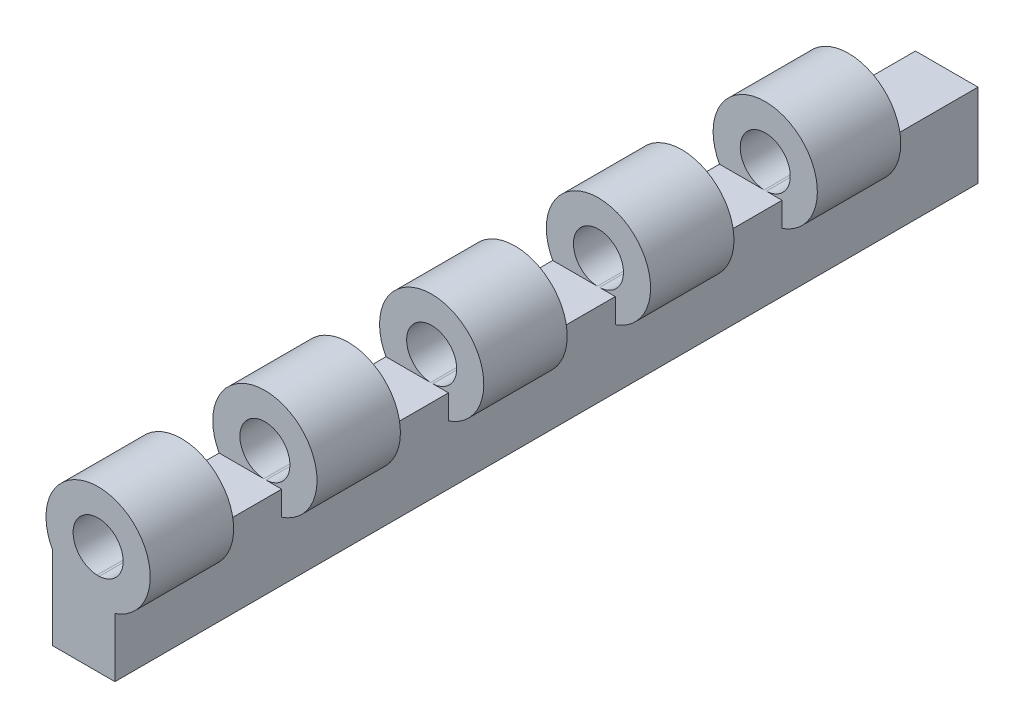
ISO-10303-21;
HEADER;
FILE_DESCRIPTION(('STEP AP214'),'2;1');
FILE_NAME('part.step','',(''),(''),'','','');
FILE_SCHEMA(('AUTOMOTIVE_DESIGN { 1 0 10303 214 1 1 1 1 }'));
ENDSEC;
DATA;
#1=APPLICATION_CONTEXT('core data for automotive mechanical design processes');
#2=APPLICATION_PROTOCOL_DEFINITION('international standard','automotive_design',2000,#1);
#3=PRODUCT_CONTEXT('',#1,'mechanical');
#4=PRODUCT('Part','Part','',(#3));
#5=PRODUCT_RELATED_PRODUCT_CATEGORY('part','',(#4));
#6=PRODUCT_DEFINITION_FORMATION('','',#4);
#7=PRODUCT_DEFINITION_CONTEXT('part definition',#1,'design');
#8=PRODUCT_DEFINITION('design','',#6,#7);
#9=PRODUCT_DEFINITION_SHAPE('','',#8);
#10=(LENGTH_UNIT() NAMED_UNIT(*) SI_UNIT(.MILLI.,.METRE.));
#11=(NAMED_UNIT(*) PLANE_ANGLE_UNIT() SI_UNIT($,.RADIAN.));
#12=(NAMED_UNIT(*) SI_UNIT($,.STERADIAN.) SOLID_ANGLE_UNIT());
#13=UNCERTAINTY_MEASURE_WITH_UNIT(LENGTH_MEASURE(1.E-05),#10,'distance_accuracy_value','');
#14=(GEOMETRIC_REPRESENTATION_CONTEXT(3) GLOBAL_UNCERTAINTY_ASSIGNED_CONTEXT((#13)) GLOBAL_UNIT_ASSIGNED_CONTEXT((#10,
#11,#12)) REPRESENTATION_CONTEXT('',''));
#15=CARTESIAN_POINT('',(0.,0.,0.));
#16=DIRECTION('',(0.,0.,1.));
#17=DIRECTION('',(1.,0.,0.));
#18=AXIS2_PLACEMENT_3D('',#15,#16,#17);
#19=CARTESIAN_POINT('',(0.,20.,0.));
#20=DIRECTION('',(0.,1.,0.));
#21=DIRECTION('',(0.,0.,1.));
#22=AXIS2_PLACEMENT_3D('',#19,#20,#21);
#23=PLANE('',#22);
#24=DIRECTION('',(0.,0.,1.));
#25=VECTOR('',#24,1.);
#26=CARTESIAN_POINT('',(0.,20.,-103.5));
#27=LINE('',#26,#25);
#28=CARTESIAN_POINT('',(0.,20.,-103.5));
#29=VERTEX_POINT('',#28);
#30=CARTESIAN_POINT('',(0.,20.,-76.5));
#31=VERTEX_POINT('',#30);
#32=EDGE_CURVE('E359',#29,#31,#27,.T.);
#33=ORIENTED_EDGE('',*,*,#32,.T.);
#34=DIRECTION('',(1.,0.,0.));
#35=VECTOR('',#34,1.);
#36=CARTESIAN_POINT('',(0.,20.,-76.5));
#37=LINE('',#36,#35);
#38=CARTESIAN_POINT('',(10.7061718741469,20.,-76.5));
#39=VERTEX_POINT('',#38);
#40=EDGE_CURVE('E50',#31,#39,#37,.T.);
#41=ORIENTED_EDGE('',*,*,#40,.T.);
#42=DIRECTION('',(0.,0.,1.));
#43=VECTOR('',#42,1.);
#44=CARTESIAN_POINT('',(10.7061718741469,20.,-76.5));
#45=LINE('',#44,#43);
#46=CARTESIAN_POINT('',(10.7061718741469,20.,-56.5));
#47=VERTEX_POINT('',#46);
#48=EDGE_CURVE('E11',#39,#47,#45,.T.);
#49=ORIENTED_EDGE('',*,*,#48,.T.);
#50=DIRECTION('',(1.,0.,0.));
#51=VECTOR('',#50,1.);
#52=CARTESIAN_POINT('',(0.,20.,-56.5));
#53=LINE('',#52,#51);
#54=CARTESIAN_POINT('',(0.,20.,-56.5));
#55=VERTEX_POINT('',#54);
#56=EDGE_CURVE('E226',#55,#47,#53,.T.);
#57=ORIENTED_EDGE('',*,*,#56,.F.);
#58=CARTESIAN_POINT('',(0.,20.,-36.5));
#59=VERTEX_POINT('',#58);
#60=EDGE_CURVE('E363',#55,#59,#27,.T.);
#61=ORIENTED_EDGE('',*,*,#60,.T.);
#62=DIRECTION('',(1.,0.,0.));
#63=VECTOR('',#62,1.);
#64=CARTESIAN_POINT('',(0.,20.,-36.5));
#65=LINE('',#64,#63);
#66=CARTESIAN_POINT('',(10.7061718741469,20.,-36.5));
#67=VERTEX_POINT('',#66);
#68=EDGE_CURVE('E267',#59,#67,#65,.T.);
#69=ORIENTED_EDGE('',*,*,#68,.T.);
#70=DIRECTION('',(0.,0.,1.));
#71=VECTOR('',#70,1.);
#72=CARTESIAN_POINT('',(10.7061718741469,20.,-36.5));
#73=LINE('',#72,#71);
#74=CARTESIAN_POINT('',(10.7061718741469,20.,-16.5));
#75=VERTEX_POINT('',#74);
#76=EDGE_CURVE('E220',#67,#75,#73,.T.);
#77=ORIENTED_EDGE('',*,*,#76,.T.);
#78=DIRECTION('',(1.,0.,0.));
#79=VECTOR('',#78,1.);
#80=CARTESIAN_POINT('',(0.,20.,-16.5));
#81=LINE('',#80,#79);
#82=CARTESIAN_POINT('',(0.,20.,-16.5));
#83=VERTEX_POINT('',#82);
#84=EDGE_CURVE('E262',#83,#75,#81,.T.);
#85=ORIENTED_EDGE('',*,*,#84,.F.);
#86=CARTESIAN_POINT('',(0.,20.,3.49999999999999));
#87=VERTEX_POINT('',#86);
#88=EDGE_CURVE('E484',#83,#87,#27,.T.);
#89=ORIENTED_EDGE('',*,*,#88,.T.);
#90=DIRECTION('',(1.,0.,0.));
#91=VECTOR('',#90,1.);
#92=CARTESIAN_POINT('',(0.,20.,3.49999999999999));
#93=LINE('',#92,#91);
#94=CARTESIAN_POINT('',(10.7061718741469,20.,3.49999999999999));
#95=VERTEX_POINT('',#94);
#96=EDGE_CURVE('E294',#87,#95,#93,.T.);
#97=ORIENTED_EDGE('',*,*,#96,.T.);
#98=DIRECTION('',(0.,0.,1.));
#99=VECTOR('',#98,1.);
#100=CARTESIAN_POINT('',(10.7061718741469,20.,3.49999999999999));
#101=LINE('',#100,#99);
#102=CARTESIAN_POINT('',(10.7061718741469,20.,23.5));
#103=VERTEX_POINT('',#102);
#104=EDGE_CURVE('E394',#95,#103,#101,.T.);
#105=ORIENTED_EDGE('',*,*,#104,.T.);
#106=DIRECTION('',(1.,0.,0.));
#107=VECTOR('',#106,1.);
#108=CARTESIAN_POINT('',(0.,20.,23.5));
#109=LINE('',#108,#107);
#110=CARTESIAN_POINT('',(0.,20.,23.5));
#111=VERTEX_POINT('',#110);
#112=EDGE_CURVE('E288',#111,#103,#109,.T.);
#113=ORIENTED_EDGE('',*,*,#112,.F.);
#114=CARTESIAN_POINT('',(0.,20.,43.5));
#115=VERTEX_POINT('',#114);
#116=EDGE_CURVE('E478',#111,#115,#27,.T.);
#117=ORIENTED_EDGE('',*,*,#116,.T.);
#118=DIRECTION('',(1.,0.,0.));
#119=VECTOR('',#118,1.);
#120=CARTESIAN_POINT('',(0.,20.,43.5));
#121=LINE('',#120,#119);
#122=CARTESIAN_POINT('',(10.7061718741469,20.,43.5));
#123=VERTEX_POINT('',#122);
#124=EDGE_CURVE('E321',#115,#123,#121,.T.);
#125=ORIENTED_EDGE('',*,*,#124,.T.);
#126=DIRECTION('',(0.,0.,1.));
#127=VECTOR('',#126,1.);
#128=CARTESIAN_POINT('',(10.7061718741469,20.,43.5));
#129=LINE('',#128,#127);
#130=CARTESIAN_POINT('',(10.7061718741469,20.,63.5));
#131=VERTEX_POINT('',#130);
#132=EDGE_CURVE('E389',#123,#131,#129,.T.);
#133=ORIENTED_EDGE('',*,*,#132,.T.);
#134=DIRECTION('',(1.,0.,0.));
#135=VECTOR('',#134,1.);
#136=CARTESIAN_POINT('',(0.,20.,63.5));
#137=LINE('',#136,#135);
#138=CARTESIAN_POINT('',(0.,20.,63.5));
#139=VERTEX_POINT('',#138);
#140=EDGE_CURVE('E315',#139,#131,#137,.T.);
#141=ORIENTED_EDGE('',*,*,#140,.F.);
#142=CARTESIAN_POINT('',(0.,20.,83.5));
#143=VERTEX_POINT('',#142);
#144=EDGE_CURVE('E472',#139,#143,#27,.T.);
#145=ORIENTED_EDGE('',*,*,#144,.T.);
#146=DIRECTION('',(1.,0.,0.));
#147=VECTOR('',#146,1.);
#148=CARTESIAN_POINT('',(0.,20.,83.5));
#149=LINE('',#148,#147);
#150=CARTESIAN_POINT('',(10.7061718741469,20.,83.5));
#151=VERTEX_POINT('',#150);
#152=EDGE_CURVE('E349',#143,#151,#149,.T.);
#153=ORIENTED_EDGE('',*,*,#152,.T.);
#154=DIRECTION('',(0.,0.,1.));
#155=VECTOR('',#154,1.);
#156=CARTESIAN_POINT('',(10.7061718741469,20.,83.5));
#157=LINE('',#156,#155);
#158=CARTESIAN_POINT('',(10.7061718741469,20.,103.5));
#159=VERTEX_POINT('',#158);
#160=EDGE_CURVE('E346',#151,#159,#157,.T.);
#161=ORIENTED_EDGE('',*,*,#160,.T.);
#162=DIRECTION('',(1.,0.,0.));
#163=VECTOR('',#162,1.);
#164=CARTESIAN_POINT('',(0.,20.,103.5));
#165=LINE('',#164,#163);
#166=CARTESIAN_POINT('',(11.2318391123888,20.,103.5));
#167=VERTEX_POINT('',#166);
#168=EDGE_CURVE('E383',#159,#167,#165,.T.);
#169=ORIENTED_EDGE('',*,*,#168,.T.);
#170=DIRECTION('',(0.,0.,1.));
#171=VECTOR('',#170,1.);
#172=CARTESIAN_POINT('',(11.2318391123888,20.,83.5));
#173=LINE('',#172,#171);
#174=CARTESIAN_POINT('',(11.2318391123888,20.,83.5));
#175=VERTEX_POINT('',#174);
#176=EDGE_CURVE('E341',#167,#175,#173,.F.);
#177=ORIENTED_EDGE('',*,*,#176,.T.);
#178=CARTESIAN_POINT('',(15.,20.,83.5));
#179=VERTEX_POINT('',#178);
#180=EDGE_CURVE('E344',#175,#179,#149,.T.);
#181=ORIENTED_EDGE('',*,*,#180,.T.);
#182=DIRECTION('',(0.,0.,-1.));
#183=VECTOR('',#182,1.);
#184=CARTESIAN_POINT('',(15.,20.,-103.5));
#185=LINE('',#184,#183);
#186=CARTESIAN_POINT('',(15.,20.,63.5));
#187=VERTEX_POINT('',#186);
#188=EDGE_CURVE('E351',#179,#187,#185,.T.);
#189=ORIENTED_EDGE('',*,*,#188,.T.);
#190=CARTESIAN_POINT('',(11.2318391123888,20.,63.5));
#191=VERTEX_POINT('',#190);
#192=EDGE_CURVE('E313',#191,#187,#137,.T.);
#193=ORIENTED_EDGE('',*,*,#192,.F.);
#194=DIRECTION('',(0.,0.,1.));
#195=VECTOR('',#194,1.);
#196=CARTESIAN_POINT('',(11.2318391123888,20.,43.5));
#197=LINE('',#196,#195);
#198=CARTESIAN_POINT('',(11.2318391123888,20.,43.5));
#199=VERTEX_POINT('',#198);
#200=EDGE_CURVE('E386',#191,#199,#197,.F.);
#201=ORIENTED_EDGE('',*,*,#200,.T.);
#202=CARTESIAN_POINT('',(15.,20.,43.5));
#203=VERTEX_POINT('',#202);
#204=EDGE_CURVE('E318',#199,#203,#121,.T.);
#205=ORIENTED_EDGE('',*,*,#204,.T.);
#206=CARTESIAN_POINT('',(15.,20.,23.5));
#207=VERTEX_POINT('',#206);
#208=EDGE_CURVE('E355',#203,#207,#185,.T.);
#209=ORIENTED_EDGE('',*,*,#208,.T.);
#210=CARTESIAN_POINT('',(11.2318391123888,20.,23.5));
#211=VERTEX_POINT('',#210);
#212=EDGE_CURVE('E286',#211,#207,#109,.T.);
#213=ORIENTED_EDGE('',*,*,#212,.F.);
#214=DIRECTION('',(0.,0.,1.));
#215=VECTOR('',#214,1.);
#216=CARTESIAN_POINT('',(11.2318391123888,20.,3.49999999999999));
#217=LINE('',#216,#215);
#218=CARTESIAN_POINT('',(11.2318391123888,20.,3.49999999999999));
#219=VERTEX_POINT('',#218);
#220=EDGE_CURVE('E391',#211,#219,#217,.F.);
#221=ORIENTED_EDGE('',*,*,#220,.T.);
#222=CARTESIAN_POINT('',(15.,20.,3.49999999999999));
#223=VERTEX_POINT('',#222);
#224=EDGE_CURVE('E291',#219,#223,#93,.T.);
#225=ORIENTED_EDGE('',*,*,#224,.T.);
#226=CARTESIAN_POINT('',(15.,20.,-16.5));
#227=VERTEX_POINT('',#226);
#228=EDGE_CURVE('E414',#223,#227,#185,.T.);
#229=ORIENTED_EDGE('',*,*,#228,.T.);
#230=CARTESIAN_POINT('',(11.2318391123888,20.,-16.5));
#231=VERTEX_POINT('',#230);
#232=EDGE_CURVE('E260',#231,#227,#81,.T.);
#233=ORIENTED_EDGE('',*,*,#232,.F.);
#234=DIRECTION('',(0.,0.,1.));
#235=VECTOR('',#234,1.);
#236=CARTESIAN_POINT('',(11.2318391123888,20.,-36.5));
#237=LINE('',#236,#235);
#238=CARTESIAN_POINT('',(11.2318391123888,20.,-36.5));
#239=VERTEX_POINT('',#238);
#240=EDGE_CURVE('E396',#231,#239,#237,.F.);
#241=ORIENTED_EDGE('',*,*,#240,.T.);
#242=CARTESIAN_POINT('',(15.,20.,-36.5));
#243=VERTEX_POINT('',#242);
#244=EDGE_CURVE('E265',#239,#243,#65,.T.);
#245=ORIENTED_EDGE('',*,*,#244,.T.);
#246=CARTESIAN_POINT('',(15.,20.,-56.5));
#247=VERTEX_POINT('',#246);
#248=EDGE_CURVE('E231',#243,#247,#185,.T.);
#249=ORIENTED_EDGE('',*,*,#248,.T.);
#250=CARTESIAN_POINT('',(11.2318391123888,20.,-56.5));
#251=VERTEX_POINT('',#250);
#252=EDGE_CURVE('E224',#251,#247,#53,.T.);
#253=ORIENTED_EDGE('',*,*,#252,.F.);
#254=DIRECTION('',(0.,0.,1.));
#255=VECTOR('',#254,1.);
#256=CARTESIAN_POINT('',(11.2318391123888,20.,-76.5));
#257=LINE('',#256,#255);
#258=CARTESIAN_POINT('',(11.2318391123888,20.,-76.5));
#259=VERTEX_POINT('',#258);
#260=EDGE_CURVE('E40',#251,#259,#257,.F.);
#261=ORIENTED_EDGE('',*,*,#260,.T.);
#262=CARTESIAN_POINT('',(15.,20.,-76.5));
#263=VERTEX_POINT('',#262);
#264=EDGE_CURVE('E240',#259,#263,#37,.T.);
#265=ORIENTED_EDGE('',*,*,#264,.T.);
#266=CARTESIAN_POINT('',(15.,20.,-103.5));
#267=VERTEX_POINT('',#266);
#268=EDGE_CURVE('E356',#263,#267,#185,.T.);
#269=ORIENTED_EDGE('',*,*,#268,.T.);
#270=DIRECTION('',(-1.,0.,0.));
#271=VECTOR('',#270,1.);
#272=CARTESIAN_POINT('',(0.,20.,-103.5));
#273=LINE('',#272,#271);
#274=EDGE_CURVE('E354',#267,#29,#273,.T.);
#275=ORIENTED_EDGE('',*,*,#274,.T.);
#276=EDGE_LOOP('',(#33,#41,#49,#57,#61,#69,#77,#85,#89,#97,#105,#113,#117,#125,#133,#141,#145,
#153,#161,#169,#177,#181,#189,#193,#201,#205,#209,#213,#221,#225,#229,#233,#241,#245,#249,#253,
#261,#265,#269,#275));
#277=FACE_BOUND('',#276,.T.);
#278=ADVANCED_FACE('F32',(#277),#23,.T.);
#279=CARTESIAN_POINT('',(15.,20.,-103.5));
#280=DIRECTION('',(-1.,0.,0.));
#281=DIRECTION('',(0.,0.,1.));
#282=AXIS2_PLACEMENT_3D('',#279,#280,#281);
#283=PLANE('',#282);
#284=DIRECTION('',(0.,1.,0.));
#285=VECTOR('',#284,1.);
#286=CARTESIAN_POINT('',(15.,20.,-76.5));
#287=LINE('',#286,#285);
#288=CARTESIAN_POINT('',(15.,14.1620350996849,-76.5));
#289=VERTEX_POINT('',#288);
#290=EDGE_CURVE('E234',#289,#263,#287,.T.);
#291=ORIENTED_EDGE('',*,*,#290,.F.);
#292=DIRECTION('',(0.,0.,1.));
#293=VECTOR('',#292,1.);
#294=CARTESIAN_POINT('',(15.,14.1620350996849,-76.5));
#295=LINE('',#294,#293);
#296=CARTESIAN_POINT('',(15.,14.1620350996849,-56.5));
#297=VERTEX_POINT('',#296);
#298=EDGE_CURVE('E242',#289,#297,#295,.T.);
#299=ORIENTED_EDGE('',*,*,#298,.T.);
#300=DIRECTION('',(0.,1.,0.));
#301=VECTOR('',#300,1.);
#302=CARTESIAN_POINT('',(15.,20.,-56.5));
#303=LINE('',#302,#301);
#304=EDGE_CURVE('E232',#297,#247,#303,.T.);
#305=ORIENTED_EDGE('',*,*,#304,.T.);
#306=ORIENTED_EDGE('',*,*,#248,.F.);
#307=DIRECTION('',(0.,1.,0.));
#308=VECTOR('',#307,1.);
#309=CARTESIAN_POINT('',(15.,20.,-36.5));
#310=LINE('',#309,#308);
#311=CARTESIAN_POINT('',(15.,14.1620350996849,-36.5));
#312=VERTEX_POINT('',#311);
#313=EDGE_CURVE('E263',#312,#243,#310,.T.);
#314=ORIENTED_EDGE('',*,*,#313,.F.);
#315=DIRECTION('',(0.,0.,1.));
#316=VECTOR('',#315,1.);
#317=CARTESIAN_POINT('',(15.,14.1620350996849,-36.5));
#318=LINE('',#317,#316);
#319=CARTESIAN_POINT('',(15.,14.1620350996849,-16.5));
#320=VERTEX_POINT('',#319);
#321=EDGE_CURVE('E268',#312,#320,#318,.T.);
#322=ORIENTED_EDGE('',*,*,#321,.T.);
#323=DIRECTION('',(0.,1.,0.));
#324=VECTOR('',#323,1.);
#325=CARTESIAN_POINT('',(15.,20.,-16.5));
#326=LINE('',#325,#324);
#327=EDGE_CURVE('E255',#320,#227,#326,.T.);
#328=ORIENTED_EDGE('',*,*,#327,.T.);
#329=ORIENTED_EDGE('',*,*,#228,.F.);
#330=DIRECTION('',(0.,1.,0.));
#331=VECTOR('',#330,1.);
#332=CARTESIAN_POINT('',(15.,20.,3.49999999999999));
#333=LINE('',#332,#331);
#334=CARTESIAN_POINT('',(15.,14.1620350996849,3.49999999999999));
#335=VERTEX_POINT('',#334);
#336=EDGE_CURVE('E289',#335,#223,#333,.T.);
#337=ORIENTED_EDGE('',*,*,#336,.F.);
#338=DIRECTION('',(0.,0.,1.));
#339=VECTOR('',#338,1.);
#340=CARTESIAN_POINT('',(15.,14.1620350996849,3.49999999999999));
#341=LINE('',#340,#339);
#342=CARTESIAN_POINT('',(15.,14.1620350996849,23.5));
#343=VERTEX_POINT('',#342);
#344=EDGE_CURVE('E295',#335,#343,#341,.T.);
#345=ORIENTED_EDGE('',*,*,#344,.T.);
#346=DIRECTION('',(0.,1.,0.));
#347=VECTOR('',#346,1.);
#348=CARTESIAN_POINT('',(15.,20.,23.5));
#349=LINE('',#348,#347);
#350=EDGE_CURVE('E281',#343,#207,#349,.T.);
#351=ORIENTED_EDGE('',*,*,#350,.T.);
#352=ORIENTED_EDGE('',*,*,#208,.F.);
#353=DIRECTION('',(0.,1.,0.));
#354=VECTOR('',#353,1.);
#355=CARTESIAN_POINT('',(15.,20.,43.5));
#356=LINE('',#355,#354);
#357=CARTESIAN_POINT('',(15.,14.1620350996849,43.5));
#358=VERTEX_POINT('',#357);
#359=EDGE_CURVE('E316',#358,#203,#356,.T.);
#360=ORIENTED_EDGE('',*,*,#359,.F.);
#361=DIRECTION('',(0.,0.,1.));
#362=VECTOR('',#361,1.);
#363=CARTESIAN_POINT('',(15.,14.1620350996849,43.5));
#364=LINE('',#363,#362);
#365=CARTESIAN_POINT('',(15.,14.1620350996849,63.5));
#366=VERTEX_POINT('',#365);
#367=EDGE_CURVE('E322',#358,#366,#364,.T.);
#368=ORIENTED_EDGE('',*,*,#367,.T.);
#369=DIRECTION('',(0.,1.,0.));
#370=VECTOR('',#369,1.);
#371=CARTESIAN_POINT('',(15.,20.,63.5));
#372=LINE('',#371,#370);
#373=EDGE_CURVE('E308',#366,#187,#372,.T.);
#374=ORIENTED_EDGE('',*,*,#373,.T.);
#375=ORIENTED_EDGE('',*,*,#188,.F.);
#376=DIRECTION('',(0.,1.,0.));
#377=VECTOR('',#376,1.);
#378=CARTESIAN_POINT('',(15.,20.,83.5));
#379=LINE('',#378,#377);
#380=CARTESIAN_POINT('',(15.,14.1620350996849,83.5));
#381=VERTEX_POINT('',#380);
#382=EDGE_CURVE('E333',#381,#179,#379,.T.);
#383=ORIENTED_EDGE('',*,*,#382,.F.);
#384=DIRECTION('',(0.,0.,1.));
#385=VECTOR('',#384,1.);
#386=CARTESIAN_POINT('',(15.,14.1620350996849,83.5));
#387=LINE('',#386,#385);
#388=CARTESIAN_POINT('',(15.,14.1620350996849,103.5));
#389=VERTEX_POINT('',#388);
#390=EDGE_CURVE('E337',#381,#389,#387,.T.);
#391=ORIENTED_EDGE('',*,*,#390,.T.);
#392=DIRECTION('',(0.,-1.,0.));
#393=VECTOR('',#392,1.);
#394=CARTESIAN_POINT('',(15.,20.,103.5));
#395=LINE('',#394,#393);
#396=CARTESIAN_POINT('',(15.,0.,103.5));
#397=VERTEX_POINT('',#396);
#398=EDGE_CURVE('E345',#389,#397,#395,.T.);
#399=ORIENTED_EDGE('',*,*,#398,.T.);
#400=DIRECTION('',(0.,0.,-1.));
#401=VECTOR('',#400,1.);
#402=CARTESIAN_POINT('',(15.,0.,-103.5));
#403=LINE('',#402,#401);
#404=CARTESIAN_POINT('',(15.,0.,-103.5));
#405=VERTEX_POINT('',#404);
#406=EDGE_CURVE('E366',#397,#405,#403,.T.);
#407=ORIENTED_EDGE('',*,*,#406,.T.);
#408=DIRECTION('',(0.,-1.,0.));
#409=VECTOR('',#408,1.);
#410=CARTESIAN_POINT('',(15.,20.,-103.5));
#411=LINE('',#410,#409);
#412=EDGE_CURVE('E377',#267,#405,#411,.T.);
#413=ORIENTED_EDGE('',*,*,#412,.F.);
#414=ORIENTED_EDGE('',*,*,#268,.F.);
#415=EDGE_LOOP('',(#291,#299,#305,#306,#314,#322,#328,#329,#337,#345,#351,#352,#360,#368,#374,
#375,#383,#391,#399,#407,#413,#414));
#416=FACE_BOUND('',#415,.T.);
#417=ADVANCED_FACE('F417',(#416),#283,.F.);
#418=CARTESIAN_POINT('',(15.,20.,103.5));
#419=DIRECTION('',(0.,0.,-1.));
#420=DIRECTION('',(-1.,0.,0.));
#421=AXIS2_PLACEMENT_3D('',#418,#419,#420);
#422=PLANE('',#421);
#423=ORIENTED_EDGE('',*,*,#398,.F.);
#424=CARTESIAN_POINT('',(10.9690054932678,25.9942404430136,103.5));
#425=DIRECTION('',(0.,0.,1.));
#426=DIRECTION('',(1.,0.,0.));
#427=AXIS2_PLACEMENT_3D('',#424,#425,#426);
#428=CIRCLE('',#427,12.5);
#429=CARTESIAN_POINT('',(0.,20.,103.5));
#430=VERTEX_POINT('',#429);
#431=EDGE_CURVE('E329',#389,#430,#428,.T.);
#432=ORIENTED_EDGE('',*,*,#431,.T.);
#433=DIRECTION('',(0.,-1.,0.));
#434=VECTOR('',#433,1.);
#435=CARTESIAN_POINT('',(0.,20.,103.5));
#436=LINE('',#435,#434);
#437=CARTESIAN_POINT('',(0.,0.,103.5));
#438=VERTEX_POINT('',#437);
#439=EDGE_CURVE('E361',#430,#438,#436,.T.);
#440=ORIENTED_EDGE('',*,*,#439,.T.);
#441=DIRECTION('',(1.,0.,0.));
#442=VECTOR('',#441,1.);
#443=CARTESIAN_POINT('',(15.,0.,103.5));
#444=LINE('',#443,#442);
#445=EDGE_CURVE('E340',#438,#397,#444,.T.);
#446=ORIENTED_EDGE('',*,*,#445,.T.);
#447=EDGE_LOOP('',(#423,#432,#440,#446));
#448=FACE_BOUND('',#447,.T.);
#449=ORIENTED_EDGE('',*,*,#168,.F.);
#450=CARTESIAN_POINT('',(10.9690054932678,25.9942404430136,103.5));
#451=DIRECTION('',(0.,0.,1.));
#452=DIRECTION('',(1.,0.,0.));
#453=AXIS2_PLACEMENT_3D('',#450,#451,#452);
#454=CIRCLE('',#453,6.);
#455=EDGE_CURVE('E325',#167,#159,#454,.T.);
#456=ORIENTED_EDGE('',*,*,#455,.F.);
#457=EDGE_LOOP('',(#449,#456));
#458=FACE_BOUND('',#457,.T.);
#459=ADVANCED_FACE('F34',(#448,#458),#422,.F.);
#460=CARTESIAN_POINT('',(0.,20.,-103.5));
#461=DIRECTION('',(0.,0.,1.));
#462=DIRECTION('',(1.,0.,0.));
#463=AXIS2_PLACEMENT_3D('',#460,#461,#462);
#464=PLANE('',#463);
#465=DIRECTION('',(-1.,0.,0.));
#466=VECTOR('',#465,1.);
#467=CARTESIAN_POINT('',(0.,0.,-103.5));
#468=LINE('',#467,#466);
#469=CARTESIAN_POINT('',(0.,0.,-103.5));
#470=VERTEX_POINT('',#469);
#471=EDGE_CURVE('E368',#405,#470,#468,.T.);
#472=ORIENTED_EDGE('',*,*,#471,.T.);
#473=DIRECTION('',(0.,-1.,0.));
#474=VECTOR('',#473,1.);
#475=CARTESIAN_POINT('',(0.,20.,-103.5));
#476=LINE('',#475,#474);
#477=EDGE_CURVE('E374',#29,#470,#476,.T.);
#478=ORIENTED_EDGE('',*,*,#477,.F.);
#479=ORIENTED_EDGE('',*,*,#274,.F.);
#480=ORIENTED_EDGE('',*,*,#412,.T.);
#481=EDGE_LOOP('',(#472,#478,#479,#480));
#482=FACE_BOUND('',#481,.T.);
#483=ADVANCED_FACE('F451',(#482),#464,.F.);
#484=CARTESIAN_POINT('',(0.,20.,-103.5));
#485=DIRECTION('',(1.,0.,0.));
#486=DIRECTION('',(0.,0.,-1.));
#487=AXIS2_PLACEMENT_3D('',#484,#485,#486);
#488=PLANE('',#487);
#489=DIRECTION('',(0.,0.,1.));
#490=VECTOR('',#489,1.);
#491=CARTESIAN_POINT('',(0.,0.,-103.5));
#492=LINE('',#491,#490);
#493=EDGE_CURVE('E370',#470,#438,#492,.T.);
#494=ORIENTED_EDGE('',*,*,#493,.T.);
#495=ORIENTED_EDGE('',*,*,#439,.F.);
#496=EDGE_CURVE('E358',#143,#430,#27,.T.);
#497=ORIENTED_EDGE('',*,*,#496,.F.);
#498=ORIENTED_EDGE('',*,*,#144,.F.);
#499=EDGE_CURVE('E475',#115,#139,#27,.T.);
#500=ORIENTED_EDGE('',*,*,#499,.F.);
#501=ORIENTED_EDGE('',*,*,#116,.F.);
#502=EDGE_CURVE('E476',#87,#111,#27,.T.);
#503=ORIENTED_EDGE('',*,*,#502,.F.);
#504=ORIENTED_EDGE('',*,*,#88,.F.);
#505=EDGE_CURVE('E481',#59,#83,#27,.T.);
#506=ORIENTED_EDGE('',*,*,#505,.F.);
#507=ORIENTED_EDGE('',*,*,#60,.F.);
#508=EDGE_CURVE('E362',#31,#55,#27,.T.);
#509=ORIENTED_EDGE('',*,*,#508,.F.);
#510=ORIENTED_EDGE('',*,*,#32,.F.);
#511=ORIENTED_EDGE('',*,*,#477,.T.);
#512=EDGE_LOOP('',(#494,#495,#497,#498,#500,#501,#503,#504,#506,#507,#509,#510,#511));
#513=FACE_BOUND('',#512,.T.);
#514=ADVANCED_FACE('F447',(#513),#488,.F.);
#515=CARTESIAN_POINT('',(0.,0.,0.));
#516=DIRECTION('',(0.,1.,0.));
#517=DIRECTION('',(0.,0.,1.));
#518=AXIS2_PLACEMENT_3D('',#515,#516,#517);
#519=PLANE('',#518);
#520=ORIENTED_EDGE('',*,*,#445,.F.);
#521=ORIENTED_EDGE('',*,*,#493,.F.);
#522=ORIENTED_EDGE('',*,*,#471,.F.);
#523=ORIENTED_EDGE('',*,*,#406,.F.);
#524=EDGE_LOOP('',(#520,#521,#522,#523));
#525=FACE_BOUND('',#524,.T.);
#526=ADVANCED_FACE('F444',(#525),#519,.F.);
#527=CARTESIAN_POINT('',(10.9690054932678,25.9942404430136,83.5));
#528=DIRECTION('',(0.,0.,1.));
#529=DIRECTION('',(1.,0.,0.));
#530=AXIS2_PLACEMENT_3D('',#527,#528,#529);
#531=CYLINDRICAL_SURFACE('',#530,12.5);
#532=ORIENTED_EDGE('',*,*,#390,.F.);
#533=CARTESIAN_POINT('',(10.9690054932678,25.9942404430136,83.5));
#534=DIRECTION('',(0.,0.,1.));
#535=DIRECTION('',(1.,0.,0.));
#536=AXIS2_PLACEMENT_3D('',#533,#534,#535);
#537=CIRCLE('',#536,12.5);
#538=EDGE_CURVE('E330',#381,#143,#537,.T.);
#539=ORIENTED_EDGE('',*,*,#538,.T.);
#540=ORIENTED_EDGE('',*,*,#496,.T.);
#541=ORIENTED_EDGE('',*,*,#431,.F.);
#542=EDGE_LOOP('',(#532,#539,#540,#541));
#543=FACE_BOUND('',#542,.T.);
#544=ADVANCED_FACE('F442',(#543),#531,.T.);
#545=CARTESIAN_POINT('',(10.9690054932678,25.9942404430136,83.5));
#546=DIRECTION('',(0.,0.,1.));
#547=DIRECTION('',(1.,0.,0.));
#548=AXIS2_PLACEMENT_3D('',#545,#546,#547);
#549=PLANE('',#548);
#550=ORIENTED_EDGE('',*,*,#152,.F.);
#551=ORIENTED_EDGE('',*,*,#538,.F.);
#552=ORIENTED_EDGE('',*,*,#382,.T.);
#553=ORIENTED_EDGE('',*,*,#180,.F.);
#554=CARTESIAN_POINT('',(10.9690054932678,25.9942404430136,83.5));
#555=DIRECTION('',(0.,0.,1.));
#556=DIRECTION('',(1.,0.,0.));
#557=AXIS2_PLACEMENT_3D('',#554,#555,#556);
#558=CIRCLE('',#557,6.);
#559=EDGE_CURVE('E326',#175,#151,#558,.T.);
#560=ORIENTED_EDGE('',*,*,#559,.T.);
#561=EDGE_LOOP('',(#550,#551,#552,#553,#560));
#562=FACE_BOUND('',#561,.T.);
#563=ADVANCED_FACE('F545',(#562),#549,.F.);
#564=CARTESIAN_POINT('',(10.9690054932678,25.9942404430136,83.5));
#565=DIRECTION('',(0.,0.,1.));
#566=DIRECTION('',(1.,0.,0.));
#567=AXIS2_PLACEMENT_3D('',#564,#565,#566);
#568=CYLINDRICAL_SURFACE('',#567,6.);
#569=ORIENTED_EDGE('',*,*,#160,.F.);
#570=ORIENTED_EDGE('',*,*,#559,.F.);
#571=ORIENTED_EDGE('',*,*,#176,.F.);
#572=ORIENTED_EDGE('',*,*,#455,.T.);
#573=EDGE_LOOP('',(#569,#570,#571,#572));
#574=FACE_BOUND('',#573,.T.);
#575=ADVANCED_FACE('F543',(#574),#568,.F.);
#576=CARTESIAN_POINT('',(10.9690054932678,25.9942404430136,43.5));
#577=DIRECTION('',(0.,0.,1.));
#578=DIRECTION('',(1.,0.,0.));
#579=AXIS2_PLACEMENT_3D('',#576,#577,#578);
#580=CYLINDRICAL_SURFACE('',#579,12.5);
#581=ORIENTED_EDGE('',*,*,#367,.F.);
#582=CARTESIAN_POINT('',(10.9690054932678,25.9942404430136,43.5));
#583=DIRECTION('',(0.,0.,1.));
#584=DIRECTION('',(1.,0.,0.));
#585=AXIS2_PLACEMENT_3D('',#582,#583,#584);
#586=CIRCLE('',#585,12.5);
#587=EDGE_CURVE('E305',#358,#115,#586,.T.);
#588=ORIENTED_EDGE('',*,*,#587,.T.);
#589=ORIENTED_EDGE('',*,*,#499,.T.);
#590=CARTESIAN_POINT('',(10.9690054932678,25.9942404430136,63.5));
#591=DIRECTION('',(0.,0.,1.));
#592=DIRECTION('',(1.,0.,0.));
#593=AXIS2_PLACEMENT_3D('',#590,#591,#592);
#594=CIRCLE('',#593,12.5);
#595=EDGE_CURVE('E302',#366,#139,#594,.T.);
#596=ORIENTED_EDGE('',*,*,#595,.F.);
#597=EDGE_LOOP('',(#581,#588,#589,#596));
#598=FACE_BOUND('',#597,.T.);
#599=ADVANCED_FACE('F536',(#598),#580,.T.);
#600=CARTESIAN_POINT('',(10.9690054932678,25.9942404430136,43.5));
#601=DIRECTION('',(0.,0.,1.));
#602=DIRECTION('',(1.,0.,0.));
#603=AXIS2_PLACEMENT_3D('',#600,#601,#602);
#604=PLANE('',#603);
#605=ORIENTED_EDGE('',*,*,#124,.F.);
#606=ORIENTED_EDGE('',*,*,#587,.F.);
#607=ORIENTED_EDGE('',*,*,#359,.T.);
#608=ORIENTED_EDGE('',*,*,#204,.F.);
#609=CARTESIAN_POINT('',(10.9690054932678,25.9942404430136,43.5));
#610=DIRECTION('',(0.,0.,1.));
#611=DIRECTION('',(1.,0.,0.));
#612=AXIS2_PLACEMENT_3D('',#609,#610,#611);
#613=CIRCLE('',#612,6.);
#614=EDGE_CURVE('E299',#199,#123,#613,.T.);
#615=ORIENTED_EDGE('',*,*,#614,.T.);
#616=EDGE_LOOP('',(#605,#606,#607,#608,#615));
#617=FACE_BOUND('',#616,.T.);
#618=ADVANCED_FACE('F533',(#617),#604,.F.);
#619=CARTESIAN_POINT('',(10.9690054932678,25.9942404430136,63.5));
#620=DIRECTION('',(0.,0.,1.));
#621=DIRECTION('',(1.,0.,0.));
#622=AXIS2_PLACEMENT_3D('',#619,#620,#621);
#623=PLANE('',#622);
#624=ORIENTED_EDGE('',*,*,#595,.T.);
#625=ORIENTED_EDGE('',*,*,#140,.T.);
#626=CARTESIAN_POINT('',(10.9690054932678,25.9942404430136,63.5));
#627=DIRECTION('',(0.,0.,1.));
#628=DIRECTION('',(1.,0.,0.));
#629=AXIS2_PLACEMENT_3D('',#626,#627,#628);
#630=CIRCLE('',#629,6.);
#631=EDGE_CURVE('E298',#191,#131,#630,.T.);
#632=ORIENTED_EDGE('',*,*,#631,.F.);
#633=ORIENTED_EDGE('',*,*,#192,.T.);
#634=ORIENTED_EDGE('',*,*,#373,.F.);
#635=EDGE_LOOP('',(#624,#625,#632,#633,#634));
#636=FACE_BOUND('',#635,.T.);
#637=ADVANCED_FACE('F531',(#636),#623,.T.);
#638=CARTESIAN_POINT('',(10.9690054932678,25.9942404430136,43.5));
#639=DIRECTION('',(0.,0.,1.));
#640=DIRECTION('',(1.,0.,0.));
#641=AXIS2_PLACEMENT_3D('',#638,#639,#640);
#642=CYLINDRICAL_SURFACE('',#641,6.);
#643=ORIENTED_EDGE('',*,*,#132,.F.);
#644=ORIENTED_EDGE('',*,*,#614,.F.);
#645=ORIENTED_EDGE('',*,*,#200,.F.);
#646=ORIENTED_EDGE('',*,*,#631,.T.);
#647=EDGE_LOOP('',(#643,#644,#645,#646));
#648=FACE_BOUND('',#647,.T.);
#649=ADVANCED_FACE('F528',(#648),#642,.F.);
#650=CARTESIAN_POINT('',(10.9690054932678,25.9942404430136,3.49999999999999));
#651=DIRECTION('',(0.,0.,1.));
#652=DIRECTION('',(1.,0.,0.));
#653=AXIS2_PLACEMENT_3D('',#650,#651,#652);
#654=CYLINDRICAL_SURFACE('',#653,12.5);
#655=ORIENTED_EDGE('',*,*,#344,.F.);
#656=CARTESIAN_POINT('',(10.9690054932678,25.9942404430136,3.49999999999999));
#657=DIRECTION('',(0.,0.,1.));
#658=DIRECTION('',(1.,0.,0.));
#659=AXIS2_PLACEMENT_3D('',#656,#657,#658);
#660=CIRCLE('',#659,12.5);
#661=EDGE_CURVE('E278',#335,#87,#660,.T.);
#662=ORIENTED_EDGE('',*,*,#661,.T.);
#663=ORIENTED_EDGE('',*,*,#502,.T.);
#664=CARTESIAN_POINT('',(10.9690054932678,25.9942404430136,23.5));
#665=DIRECTION('',(0.,0.,1.));
#666=DIRECTION('',(1.,0.,0.));
#667=AXIS2_PLACEMENT_3D('',#664,#665,#666);
#668=CIRCLE('',#667,12.5);
#669=EDGE_CURVE('E275',#343,#111,#668,.T.);
#670=ORIENTED_EDGE('',*,*,#669,.F.);
#671=EDGE_LOOP('',(#655,#662,#663,#670));
#672=FACE_BOUND('',#671,.T.);
#673=ADVANCED_FACE('F509',(#672),#654,.T.);
#674=CARTESIAN_POINT('',(10.9690054932678,25.9942404430136,3.49999999999999));
#675=DIRECTION('',(0.,0.,1.));
#676=DIRECTION('',(1.,0.,0.));
#677=AXIS2_PLACEMENT_3D('',#674,#675,#676);
#678=PLANE('',#677);
#679=ORIENTED_EDGE('',*,*,#96,.F.);
#680=ORIENTED_EDGE('',*,*,#661,.F.);
#681=ORIENTED_EDGE('',*,*,#336,.T.);
#682=ORIENTED_EDGE('',*,*,#224,.F.);
#683=CARTESIAN_POINT('',(10.9690054932678,25.9942404430136,3.49999999999999));
#684=DIRECTION('',(0.,0.,1.));
#685=DIRECTION('',(1.,0.,0.));
#686=AXIS2_PLACEMENT_3D('',#683,#684,#685);
#687=CIRCLE('',#686,6.);
#688=EDGE_CURVE('E272',#219,#95,#687,.T.);
#689=ORIENTED_EDGE('',*,*,#688,.T.);
#690=EDGE_LOOP('',(#679,#680,#681,#682,#689));
#691=FACE_BOUND('',#690,.T.);
#692=ADVANCED_FACE('F513',(#691),#678,.F.);
#693=CARTESIAN_POINT('',(10.9690054932678,25.9942404430136,23.5));
#694=DIRECTION('',(0.,0.,1.));
#695=DIRECTION('',(1.,0.,0.));
#696=AXIS2_PLACEMENT_3D('',#693,#694,#695);
#697=PLANE('',#696);
#698=ORIENTED_EDGE('',*,*,#669,.T.);
#699=ORIENTED_EDGE('',*,*,#112,.T.);
#700=CARTESIAN_POINT('',(10.9690054932678,25.9942404430136,23.5));
#701=DIRECTION('',(0.,0.,1.));
#702=DIRECTION('',(1.,0.,0.));
#703=AXIS2_PLACEMENT_3D('',#700,#701,#702);
#704=CIRCLE('',#703,6.);
#705=EDGE_CURVE('E271',#211,#103,#704,.T.);
#706=ORIENTED_EDGE('',*,*,#705,.F.);
#707=ORIENTED_EDGE('',*,*,#212,.T.);
#708=ORIENTED_EDGE('',*,*,#350,.F.);
#709=EDGE_LOOP('',(#698,#699,#706,#707,#708));
#710=FACE_BOUND('',#709,.T.);
#711=ADVANCED_FACE('F505',(#710),#697,.T.);
#712=CARTESIAN_POINT('',(10.9690054932678,25.9942404430136,3.49999999999999));
#713=DIRECTION('',(0.,0.,1.));
#714=DIRECTION('',(1.,0.,0.));
#715=AXIS2_PLACEMENT_3D('',#712,#713,#714);
#716=CYLINDRICAL_SURFACE('',#715,6.);
#717=ORIENTED_EDGE('',*,*,#104,.F.);
#718=ORIENTED_EDGE('',*,*,#688,.F.);
#719=ORIENTED_EDGE('',*,*,#220,.F.);
#720=ORIENTED_EDGE('',*,*,#705,.T.);
#721=EDGE_LOOP('',(#717,#718,#719,#720));
#722=FACE_BOUND('',#721,.T.);
#723=ADVANCED_FACE('F432',(#722),#716,.F.);
#724=CARTESIAN_POINT('',(10.9690054932678,25.9942404430136,-36.5));
#725=DIRECTION('',(0.,0.,1.));
#726=DIRECTION('',(1.,0.,0.));
#727=AXIS2_PLACEMENT_3D('',#724,#725,#726);
#728=CYLINDRICAL_SURFACE('',#727,12.5);
#729=ORIENTED_EDGE('',*,*,#321,.F.);
#730=CARTESIAN_POINT('',(10.9690054932678,25.9942404430136,-36.5));
#731=DIRECTION('',(0.,0.,1.));
#732=DIRECTION('',(1.,0.,0.));
#733=AXIS2_PLACEMENT_3D('',#730,#731,#732);
#734=CIRCLE('',#733,12.5);
#735=EDGE_CURVE('E252',#312,#59,#734,.T.);
#736=ORIENTED_EDGE('',*,*,#735,.T.);
#737=ORIENTED_EDGE('',*,*,#505,.T.);
#738=CARTESIAN_POINT('',(10.9690054932678,25.9942404430136,-16.5));
#739=DIRECTION('',(0.,0.,1.));
#740=DIRECTION('',(1.,0.,0.));
#741=AXIS2_PLACEMENT_3D('',#738,#739,#740);
#742=CIRCLE('',#741,12.5);
#743=EDGE_CURVE('E249',#320,#83,#742,.T.);
#744=ORIENTED_EDGE('',*,*,#743,.F.);
#745=EDGE_LOOP('',(#729,#736,#737,#744));
#746=FACE_BOUND('',#745,.T.);
#747=ADVANCED_FACE('F422',(#746),#728,.T.);
#748=CARTESIAN_POINT('',(10.9690054932678,25.9942404430136,-36.5));
#749=DIRECTION('',(0.,0.,1.));
#750=DIRECTION('',(1.,0.,0.));
#751=AXIS2_PLACEMENT_3D('',#748,#749,#750);
#752=PLANE('',#751);
#753=ORIENTED_EDGE('',*,*,#68,.F.);
#754=ORIENTED_EDGE('',*,*,#735,.F.);
#755=ORIENTED_EDGE('',*,*,#313,.T.);
#756=ORIENTED_EDGE('',*,*,#244,.F.);
#757=CARTESIAN_POINT('',(10.9690054932678,25.9942404430136,-36.5));
#758=DIRECTION('',(0.,0.,1.));
#759=DIRECTION('',(1.,0.,0.));
#760=AXIS2_PLACEMENT_3D('',#757,#758,#759);
#761=CIRCLE('',#760,6.);
#762=EDGE_CURVE('E246',#239,#67,#761,.T.);
#763=ORIENTED_EDGE('',*,*,#762,.T.);
#764=EDGE_LOOP('',(#753,#754,#755,#756,#763));
#765=FACE_BOUND('',#764,.T.);
#766=ADVANCED_FACE('F424',(#765),#752,.F.);
#767=CARTESIAN_POINT('',(10.9690054932678,25.9942404430136,-16.5));
#768=DIRECTION('',(0.,0.,1.));
#769=DIRECTION('',(1.,0.,0.));
#770=AXIS2_PLACEMENT_3D('',#767,#768,#769);
#771=PLANE('',#770);
#772=ORIENTED_EDGE('',*,*,#743,.T.);
#773=ORIENTED_EDGE('',*,*,#84,.T.);
#774=CARTESIAN_POINT('',(10.9690054932678,25.9942404430136,-16.5));
#775=DIRECTION('',(0.,0.,1.));
#776=DIRECTION('',(1.,0.,0.));
#777=AXIS2_PLACEMENT_3D('',#774,#775,#776);
#778=CIRCLE('',#777,6.);
#779=EDGE_CURVE('E245',#231,#75,#778,.T.);
#780=ORIENTED_EDGE('',*,*,#779,.F.);
#781=ORIENTED_EDGE('',*,*,#232,.T.);
#782=ORIENTED_EDGE('',*,*,#327,.F.);
#783=EDGE_LOOP('',(#772,#773,#780,#781,#782));
#784=FACE_BOUND('',#783,.T.);
#785=ADVANCED_FACE('F408',(#784),#771,.T.);
#786=CARTESIAN_POINT('',(10.9690054932678,25.9942404430136,-36.5));
#787=DIRECTION('',(0.,0.,1.));
#788=DIRECTION('',(1.,0.,0.));
#789=AXIS2_PLACEMENT_3D('',#786,#787,#788);
#790=CYLINDRICAL_SURFACE('',#789,6.);
#791=ORIENTED_EDGE('',*,*,#76,.F.);
#792=ORIENTED_EDGE('',*,*,#762,.F.);
#793=ORIENTED_EDGE('',*,*,#240,.F.);
#794=ORIENTED_EDGE('',*,*,#779,.T.);
#795=EDGE_LOOP('',(#791,#792,#793,#794));
#796=FACE_BOUND('',#795,.T.);
#797=ADVANCED_FACE('F411',(#796),#790,.F.);
#798=CARTESIAN_POINT('',(10.9690054932678,25.9942404430136,-76.5));
#799=DIRECTION('',(0.,0.,1.));
#800=DIRECTION('',(1.,0.,0.));
#801=AXIS2_PLACEMENT_3D('',#798,#799,#800);
#802=CYLINDRICAL_SURFACE('',#801,12.5);
#803=ORIENTED_EDGE('',*,*,#298,.F.);
#804=CARTESIAN_POINT('',(10.9690054932678,25.9942404430136,-76.5));
#805=DIRECTION('',(0.,0.,1.));
#806=DIRECTION('',(1.,0.,0.));
#807=AXIS2_PLACEMENT_3D('',#804,#805,#806);
#808=CIRCLE('',#807,12.5);
#809=EDGE_CURVE('E235',#289,#31,#808,.T.);
#810=ORIENTED_EDGE('',*,*,#809,.T.);
#811=ORIENTED_EDGE('',*,*,#508,.T.);
#812=CARTESIAN_POINT('',(10.9690054932678,25.9942404430136,-56.5));
#813=DIRECTION('',(0.,0.,1.));
#814=DIRECTION('',(1.,0.,0.));
#815=AXIS2_PLACEMENT_3D('',#812,#813,#814);
#816=CIRCLE('',#815,12.5);
#817=EDGE_CURVE('E492',#297,#55,#816,.T.);
#818=ORIENTED_EDGE('',*,*,#817,.F.);
#819=EDGE_LOOP('',(#803,#810,#811,#818));
#820=FACE_BOUND('',#819,.T.);
#821=ADVANCED_FACE('F491',(#820),#802,.T.);
#822=CARTESIAN_POINT('',(10.9690054932678,25.9942404430136,-76.5));
#823=DIRECTION('',(0.,0.,1.));
#824=DIRECTION('',(1.,0.,0.));
#825=AXIS2_PLACEMENT_3D('',#822,#823,#824);
#826=PLANE('',#825);
#827=ORIENTED_EDGE('',*,*,#40,.F.);
#828=ORIENTED_EDGE('',*,*,#809,.F.);
#829=ORIENTED_EDGE('',*,*,#290,.T.);
#830=ORIENTED_EDGE('',*,*,#264,.F.);
#831=CARTESIAN_POINT('',(10.9690054932678,25.9942404430136,-76.5));
#832=DIRECTION('',(0.,0.,1.));
#833=DIRECTION('',(1.,0.,0.));
#834=AXIS2_PLACEMENT_3D('',#831,#832,#833);
#835=CIRCLE('',#834,6.);
#836=EDGE_CURVE('E217',#259,#39,#835,.T.);
#837=ORIENTED_EDGE('',*,*,#836,.T.);
#838=EDGE_LOOP('',(#827,#828,#829,#830,#837));
#839=FACE_BOUND('',#838,.T.);
#840=ADVANCED_FACE('F497',(#839),#826,.F.);
#841=CARTESIAN_POINT('',(10.9690054932678,25.9942404430136,-56.5));
#842=DIRECTION('',(0.,0.,1.));
#843=DIRECTION('',(1.,0.,0.));
#844=AXIS2_PLACEMENT_3D('',#841,#842,#843);
#845=PLANE('',#844);
#846=ORIENTED_EDGE('',*,*,#817,.T.);
#847=ORIENTED_EDGE('',*,*,#56,.T.);
#848=CARTESIAN_POINT('',(10.9690054932678,25.9942404430136,-56.5));
#849=DIRECTION('',(0.,0.,1.));
#850=DIRECTION('',(1.,0.,0.));
#851=AXIS2_PLACEMENT_3D('',#848,#849,#850);
#852=CIRCLE('',#851,6.);
#853=EDGE_CURVE('E215',#251,#47,#852,.T.);
#854=ORIENTED_EDGE('',*,*,#853,.F.);
#855=ORIENTED_EDGE('',*,*,#252,.T.);
#856=ORIENTED_EDGE('',*,*,#304,.F.);
#857=EDGE_LOOP('',(#846,#847,#854,#855,#856));
#858=FACE_BOUND('',#857,.T.);
#859=ADVANCED_FACE('F223',(#858),#845,.T.);
#860=CARTESIAN_POINT('',(10.9690054932678,25.9942404430136,-76.5));
#861=DIRECTION('',(0.,0.,1.));
#862=DIRECTION('',(1.,0.,0.));
#863=AXIS2_PLACEMENT_3D('',#860,#861,#862);
#864=CYLINDRICAL_SURFACE('',#863,6.);
#865=ORIENTED_EDGE('',*,*,#48,.F.);
#866=ORIENTED_EDGE('',*,*,#836,.F.);
#867=ORIENTED_EDGE('',*,*,#260,.F.);
#868=ORIENTED_EDGE('',*,*,#853,.T.);
#869=EDGE_LOOP('',(#865,#866,#867,#868));
#870=FACE_BOUND('',#869,.T.);
#871=ADVANCED_FACE('F214',(#870),#864,.F.);
#872=CLOSED_SHELL('',(#278,#417,#459,#483,#514,#526,#544,#563,#575,#599,#618,#637,#649,#673,
#692,#711,#723,#747,#766,#785,#797,#821,#840,#859,#871));
#873=MANIFOLD_SOLID_BREP('B2',#872);
#874=ADVANCED_BREP_SHAPE_REPRESENTATION('',(#18,#873),#14);
#875=SHAPE_DEFINITION_REPRESENTATION(#9,#874);
ENDSEC;
END-ISO-10303-21;
